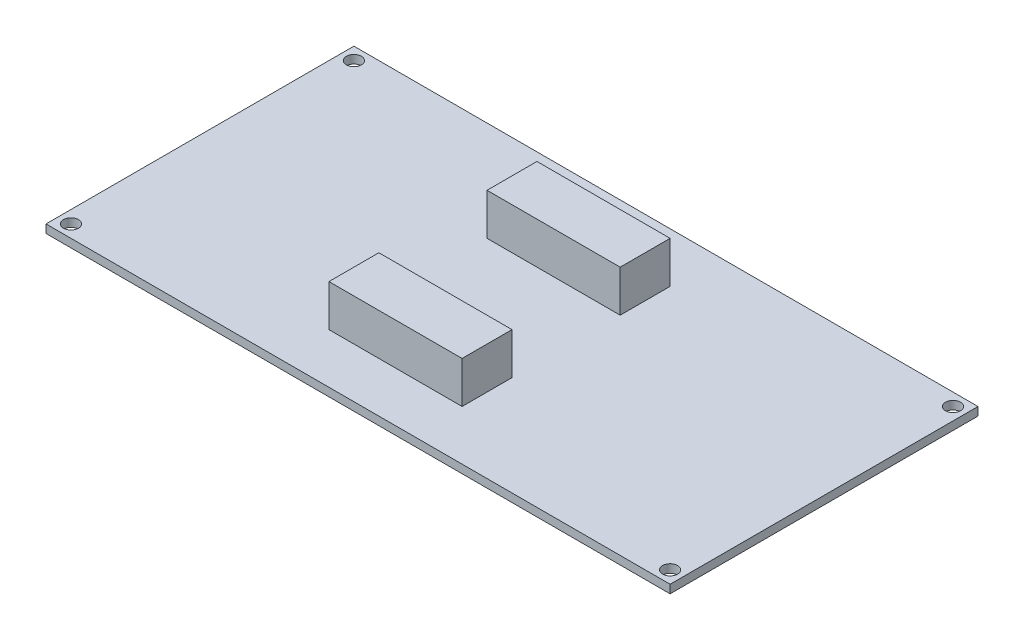
ISO-10303-21;
HEADER;
FILE_DESCRIPTION(('STEP AP214'),'2;1');
FILE_NAME('part.step','',(''),(''),'','','');
FILE_SCHEMA(('AUTOMOTIVE_DESIGN { 1 0 10303 214 1 1 1 1 }'));
ENDSEC;
DATA;
#1=APPLICATION_CONTEXT('core data for automotive mechanical design processes');
#2=APPLICATION_PROTOCOL_DEFINITION('international standard','automotive_design',2000,#1);
#3=PRODUCT_CONTEXT('',#1,'mechanical');
#4=PRODUCT('Part','Part','',(#3));
#5=PRODUCT_RELATED_PRODUCT_CATEGORY('part','',(#4));
#6=PRODUCT_DEFINITION_FORMATION('','',#4);
#7=PRODUCT_DEFINITION_CONTEXT('part definition',#1,'design');
#8=PRODUCT_DEFINITION('design','',#6,#7);
#9=PRODUCT_DEFINITION_SHAPE('','',#8);
#10=(LENGTH_UNIT() NAMED_UNIT(*) SI_UNIT(.MILLI.,.METRE.));
#11=(NAMED_UNIT(*) PLANE_ANGLE_UNIT() SI_UNIT($,.RADIAN.));
#12=(NAMED_UNIT(*) SI_UNIT($,.STERADIAN.) SOLID_ANGLE_UNIT());
#13=UNCERTAINTY_MEASURE_WITH_UNIT(LENGTH_MEASURE(1.E-05),#10,'distance_accuracy_value','');
#14=(GEOMETRIC_REPRESENTATION_CONTEXT(3) GLOBAL_UNCERTAINTY_ASSIGNED_CONTEXT((#13)) GLOBAL_UNIT_ASSIGNED_CONTEXT((#10,
#11,#12)) REPRESENTATION_CONTEXT('',''));
#15=CARTESIAN_POINT('',(0.,0.,0.));
#16=DIRECTION('',(0.,0.,1.));
#17=DIRECTION('',(1.,0.,0.));
#18=AXIS2_PLACEMENT_3D('',#15,#16,#17);
#19=CARTESIAN_POINT('',(0.,1.5875,0.));
#20=DIRECTION('',(0.,-1.,0.));
#21=DIRECTION('',(0.,0.,-1.));
#22=AXIS2_PLACEMENT_3D('',#19,#20,#21);
#23=PLANE('',#22);
#24=CARTESIAN_POINT('',(57.15,1.5875,-26.9875));
#25=DIRECTION('',(0.,1.,0.));
#26=DIRECTION('',(0.,0.,-1.));
#27=AXIS2_PLACEMENT_3D('',#24,#25,#26);
#28=CIRCLE('',#27,1.42875);
#29=CARTESIAN_POINT('',(57.15,1.5875,-28.41625));
#30=VERTEX_POINT('',#29);
#31=EDGE_CURVE('E468',#30,#30,#28,.T.);
#32=ORIENTED_EDGE('',*,*,#31,.F.);
#33=EDGE_LOOP('',(#32));
#34=FACE_BOUND('',#33,.T.);
#35=CARTESIAN_POINT('',(57.15,1.5875,26.9875));
#36=DIRECTION('',(0.,-1.,0.));
#37=DIRECTION('',(0.,0.,1.));
#38=AXIS2_PLACEMENT_3D('',#35,#36,#37);
#39=CIRCLE('',#38,1.42875);
#40=CARTESIAN_POINT('',(57.15,1.5875,28.41625));
#41=VERTEX_POINT('',#40);
#42=EDGE_CURVE('E472',#41,#41,#39,.T.);
#43=ORIENTED_EDGE('',*,*,#42,.T.);
#44=EDGE_LOOP('',(#43));
#45=FACE_BOUND('',#44,.T.);
#46=CARTESIAN_POINT('',(-57.15,1.5875,-26.9875));
#47=DIRECTION('',(0.,-1.,0.));
#48=DIRECTION('',(0.,0.,-1.));
#49=AXIS2_PLACEMENT_3D('',#46,#47,#48);
#50=CIRCLE('',#49,1.42875);
#51=CARTESIAN_POINT('',(-57.15,1.5875,-28.41625));
#52=VERTEX_POINT('',#51);
#53=EDGE_CURVE('E479',#52,#52,#50,.T.);
#54=ORIENTED_EDGE('',*,*,#53,.T.);
#55=EDGE_LOOP('',(#54));
#56=FACE_BOUND('',#55,.T.);
#57=CARTESIAN_POINT('',(-57.15,1.5875,26.9875));
#58=DIRECTION('',(0.,1.,0.));
#59=DIRECTION('',(0.,0.,1.));
#60=AXIS2_PLACEMENT_3D('',#57,#58,#59);
#61=CIRCLE('',#60,1.42875);
#62=CARTESIAN_POINT('',(-57.15,1.5875,28.41625));
#63=VERTEX_POINT('',#62);
#64=EDGE_CURVE('E487',#63,#63,#61,.T.);
#65=ORIENTED_EDGE('',*,*,#64,.F.);
#66=EDGE_LOOP('',(#65));
#67=FACE_BOUND('',#66,.T.);
#68=DIRECTION('',(1.,0.,0.));
#69=VECTOR('',#68,1.);
#70=CARTESIAN_POINT('',(-15.08125,1.5875,-19.84375));
#71=LINE('',#70,#69);
#72=CARTESIAN_POINT('',(-15.08125,1.5875,-19.84375));
#73=VERTEX_POINT('',#72);
#74=CARTESIAN_POINT('',(10.31875,1.5875,-19.84375));
#75=VERTEX_POINT('',#74);
#76=EDGE_CURVE('E168',#73,#75,#71,.T.);
#77=ORIENTED_EDGE('',*,*,#76,.T.);
#78=DIRECTION('',(0.,0.,1.));
#79=VECTOR('',#78,1.);
#80=CARTESIAN_POINT('',(10.31875,1.5875,-19.84375));
#81=LINE('',#80,#79);
#82=CARTESIAN_POINT('',(10.31875,1.5875,-10.31875));
#83=VERTEX_POINT('',#82);
#84=EDGE_CURVE('E135',#75,#83,#81,.T.);
#85=ORIENTED_EDGE('',*,*,#84,.T.);
#86=DIRECTION('',(-1.,0.,0.));
#87=VECTOR('',#86,1.);
#88=CARTESIAN_POINT('',(-15.08125,1.5875,-10.31875));
#89=LINE('',#88,#87);
#90=CARTESIAN_POINT('',(-15.08125,1.5875,-10.31875));
#91=VERTEX_POINT('',#90);
#92=EDGE_CURVE('E153',#83,#91,#89,.T.);
#93=ORIENTED_EDGE('',*,*,#92,.T.);
#94=DIRECTION('',(0.,0.,-1.));
#95=VECTOR('',#94,1.);
#96=CARTESIAN_POINT('',(-15.08125,1.5875,-19.84375));
#97=LINE('',#96,#95);
#98=EDGE_CURVE('E55',#91,#73,#97,.T.);
#99=ORIENTED_EDGE('',*,*,#98,.T.);
#100=EDGE_LOOP('',(#77,#85,#93,#99));
#101=FACE_BOUND('',#100,.T.);
#102=DIRECTION('',(0.,0.,1.));
#103=VECTOR('',#102,1.);
#104=CARTESIAN_POINT('',(-59.53125,1.5875,-29.36875));
#105=LINE('',#104,#103);
#106=CARTESIAN_POINT('',(-59.53125,1.5875,-29.36875));
#107=VERTEX_POINT('',#106);
#108=CARTESIAN_POINT('',(-59.53125,1.5875,29.36875));
#109=VERTEX_POINT('',#108);
#110=EDGE_CURVE('E226',#107,#109,#105,.T.);
#111=ORIENTED_EDGE('',*,*,#110,.T.);
#112=DIRECTION('',(1.,0.,0.));
#113=VECTOR('',#112,1.);
#114=CARTESIAN_POINT('',(59.53125,1.5875,29.36875));
#115=LINE('',#114,#113);
#116=CARTESIAN_POINT('',(59.53125,1.5875,29.36875));
#117=VERTEX_POINT('',#116);
#118=EDGE_CURVE('E230',#109,#117,#115,.T.);
#119=ORIENTED_EDGE('',*,*,#118,.T.);
#120=DIRECTION('',(0.,0.,-1.));
#121=VECTOR('',#120,1.);
#122=CARTESIAN_POINT('',(59.53125,1.5875,-29.36875));
#123=LINE('',#122,#121);
#124=CARTESIAN_POINT('',(59.53125,1.5875,-29.36875));
#125=VERTEX_POINT('',#124);
#126=EDGE_CURVE('E234',#117,#125,#123,.T.);
#127=ORIENTED_EDGE('',*,*,#126,.T.);
#128=DIRECTION('',(-1.,0.,0.));
#129=VECTOR('',#128,1.);
#130=CARTESIAN_POINT('',(59.53125,1.5875,-29.36875));
#131=LINE('',#130,#129);
#132=EDGE_CURVE('E237',#125,#107,#131,.T.);
#133=ORIENTED_EDGE('',*,*,#132,.T.);
#134=EDGE_LOOP('',(#111,#119,#127,#133));
#135=FACE_BOUND('',#134,.T.);
#136=DIRECTION('',(0.,0.,-1.));
#137=VECTOR('',#136,1.);
#138=CARTESIAN_POINT('',(10.31875,1.5875,19.84375));
#139=LINE('',#138,#137);
#140=CARTESIAN_POINT('',(10.31875,1.5875,19.84375));
#141=VERTEX_POINT('',#140);
#142=CARTESIAN_POINT('',(10.31875,1.5875,10.31875));
#143=VERTEX_POINT('',#142);
#144=EDGE_CURVE('E141',#141,#143,#139,.T.);
#145=ORIENTED_EDGE('',*,*,#144,.F.);
#146=DIRECTION('',(1.,0.,0.));
#147=VECTOR('',#146,1.);
#148=CARTESIAN_POINT('',(-15.08125,1.5875,19.84375));
#149=LINE('',#148,#147);
#150=CARTESIAN_POINT('',(-15.08125,1.5875,19.84375));
#151=VERTEX_POINT('',#150);
#152=EDGE_CURVE('E189',#151,#141,#149,.T.);
#153=ORIENTED_EDGE('',*,*,#152,.F.);
#154=DIRECTION('',(0.,0.,1.));
#155=VECTOR('',#154,1.);
#156=CARTESIAN_POINT('',(-15.08125,1.5875,19.84375));
#157=LINE('',#156,#155);
#158=CARTESIAN_POINT('',(-15.08125,1.5875,10.31875));
#159=VERTEX_POINT('',#158);
#160=EDGE_CURVE('E204',#159,#151,#157,.T.);
#161=ORIENTED_EDGE('',*,*,#160,.F.);
#162=DIRECTION('',(-1.,0.,0.));
#163=VECTOR('',#162,1.);
#164=CARTESIAN_POINT('',(-15.08125,1.5875,10.31875));
#165=LINE('',#164,#163);
#166=EDGE_CURVE('E63',#143,#159,#165,.T.);
#167=ORIENTED_EDGE('',*,*,#166,.F.);
#168=EDGE_LOOP('',(#145,#153,#161,#167));
#169=FACE_BOUND('',#168,.T.);
#170=ADVANCED_FACE('F39',(#34,#45,#56,#67,#101,#135,#169),#23,.F.);
#171=CARTESIAN_POINT('',(-59.53125,1.5875,-29.36875));
#172=DIRECTION('',(1.,0.,0.));
#173=DIRECTION('',(0.,0.,-1.));
#174=AXIS2_PLACEMENT_3D('',#171,#172,#173);
#175=PLANE('',#174);
#176=DIRECTION('',(0.,0.,1.));
#177=VECTOR('',#176,1.);
#178=CARTESIAN_POINT('',(-59.53125,0.,-29.36875));
#179=LINE('',#178,#177);
#180=CARTESIAN_POINT('',(-59.53125,0.,-29.36875));
#181=VERTEX_POINT('',#180);
#182=CARTESIAN_POINT('',(-59.53125,0.,29.36875));
#183=VERTEX_POINT('',#182);
#184=EDGE_CURVE('E225',#181,#183,#179,.T.);
#185=ORIENTED_EDGE('',*,*,#184,.T.);
#186=DIRECTION('',(0.,-1.,0.));
#187=VECTOR('',#186,1.);
#188=CARTESIAN_POINT('',(-59.53125,1.5875,29.36875));
#189=LINE('',#188,#187);
#190=EDGE_CURVE('E11',#109,#183,#189,.T.);
#191=ORIENTED_EDGE('',*,*,#190,.F.);
#192=ORIENTED_EDGE('',*,*,#110,.F.);
#193=DIRECTION('',(0.,-1.,0.));
#194=VECTOR('',#193,1.);
#195=CARTESIAN_POINT('',(-59.53125,1.5875,-29.36875));
#196=LINE('',#195,#194);
#197=EDGE_CURVE('E240',#107,#181,#196,.T.);
#198=ORIENTED_EDGE('',*,*,#197,.T.);
#199=EDGE_LOOP('',(#185,#191,#192,#198));
#200=FACE_BOUND('',#199,.T.);
#201=ADVANCED_FACE('F41',(#200),#175,.F.);
#202=CARTESIAN_POINT('',(59.53125,1.5875,29.36875));
#203=DIRECTION('',(0.,0.,-1.));
#204=DIRECTION('',(-1.,0.,0.));
#205=AXIS2_PLACEMENT_3D('',#202,#203,#204);
#206=PLANE('',#205);
#207=DIRECTION('',(1.,0.,0.));
#208=VECTOR('',#207,1.);
#209=CARTESIAN_POINT('',(59.53125,0.,29.36875));
#210=LINE('',#209,#208);
#211=CARTESIAN_POINT('',(59.53125,0.,29.36875));
#212=VERTEX_POINT('',#211);
#213=EDGE_CURVE('E244',#183,#212,#210,.T.);
#214=ORIENTED_EDGE('',*,*,#213,.T.);
#215=DIRECTION('',(0.,-1.,0.));
#216=VECTOR('',#215,1.);
#217=CARTESIAN_POINT('',(59.53125,1.5875,29.36875));
#218=LINE('',#217,#216);
#219=EDGE_CURVE('E48',#117,#212,#218,.T.);
#220=ORIENTED_EDGE('',*,*,#219,.F.);
#221=ORIENTED_EDGE('',*,*,#118,.F.);
#222=ORIENTED_EDGE('',*,*,#190,.T.);
#223=EDGE_LOOP('',(#214,#220,#221,#222));
#224=FACE_BOUND('',#223,.T.);
#225=ADVANCED_FACE('F279',(#224),#206,.F.);
#226=CARTESIAN_POINT('',(59.53125,1.5875,-29.36875));
#227=DIRECTION('',(-1.,0.,0.));
#228=DIRECTION('',(0.,0.,1.));
#229=AXIS2_PLACEMENT_3D('',#226,#227,#228);
#230=PLANE('',#229);
#231=DIRECTION('',(0.,0.,-1.));
#232=VECTOR('',#231,1.);
#233=CARTESIAN_POINT('',(59.53125,0.,-29.36875));
#234=LINE('',#233,#232);
#235=CARTESIAN_POINT('',(59.53125,0.,-29.36875));
#236=VERTEX_POINT('',#235);
#237=EDGE_CURVE('E247',#212,#236,#234,.T.);
#238=ORIENTED_EDGE('',*,*,#237,.T.);
#239=DIRECTION('',(0.,-1.,0.));
#240=VECTOR('',#239,1.);
#241=CARTESIAN_POINT('',(59.53125,1.5875,-29.36875));
#242=LINE('',#241,#240);
#243=EDGE_CURVE('E255',#125,#236,#242,.T.);
#244=ORIENTED_EDGE('',*,*,#243,.F.);
#245=ORIENTED_EDGE('',*,*,#126,.F.);
#246=ORIENTED_EDGE('',*,*,#219,.T.);
#247=EDGE_LOOP('',(#238,#244,#245,#246));
#248=FACE_BOUND('',#247,.T.);
#249=ADVANCED_FACE('F264',(#248),#230,.F.);
#250=CARTESIAN_POINT('',(59.53125,1.5875,-29.36875));
#251=DIRECTION('',(0.,0.,1.));
#252=DIRECTION('',(1.,0.,0.));
#253=AXIS2_PLACEMENT_3D('',#250,#251,#252);
#254=PLANE('',#253);
#255=DIRECTION('',(-1.,0.,0.));
#256=VECTOR('',#255,1.);
#257=CARTESIAN_POINT('',(59.53125,0.,-29.36875));
#258=LINE('',#257,#256);
#259=EDGE_CURVE('E231',#236,#181,#258,.T.);
#260=ORIENTED_EDGE('',*,*,#259,.T.);
#261=ORIENTED_EDGE('',*,*,#197,.F.);
#262=ORIENTED_EDGE('',*,*,#132,.F.);
#263=ORIENTED_EDGE('',*,*,#243,.T.);
#264=EDGE_LOOP('',(#260,#261,#262,#263));
#265=FACE_BOUND('',#264,.T.);
#266=ADVANCED_FACE('F273',(#265),#254,.F.);
#267=CARTESIAN_POINT('',(0.,0.,0.));
#268=DIRECTION('',(0.,-1.,0.));
#269=DIRECTION('',(0.,0.,-1.));
#270=AXIS2_PLACEMENT_3D('',#267,#268,#269);
#271=PLANE('',#270);
#272=CARTESIAN_POINT('',(57.15,0.,-26.9875));
#273=DIRECTION('',(0.,1.,0.));
#274=DIRECTION('',(0.,0.,-1.));
#275=AXIS2_PLACEMENT_3D('',#272,#273,#274);
#276=CIRCLE('',#275,1.42875);
#277=CARTESIAN_POINT('',(57.15,0.,-28.41625));
#278=VERTEX_POINT('',#277);
#279=EDGE_CURVE('E466',#278,#278,#276,.T.);
#280=ORIENTED_EDGE('',*,*,#279,.T.);
#281=EDGE_LOOP('',(#280));
#282=FACE_BOUND('',#281,.T.);
#283=CARTESIAN_POINT('',(57.15,0.,26.9875));
#284=DIRECTION('',(0.,-1.,0.));
#285=DIRECTION('',(0.,0.,1.));
#286=AXIS2_PLACEMENT_3D('',#283,#284,#285);
#287=CIRCLE('',#286,1.42875);
#288=CARTESIAN_POINT('',(57.15,0.,28.41625));
#289=VERTEX_POINT('',#288);
#290=EDGE_CURVE('E475',#289,#289,#287,.T.);
#291=ORIENTED_EDGE('',*,*,#290,.F.);
#292=EDGE_LOOP('',(#291));
#293=FACE_BOUND('',#292,.T.);
#294=CARTESIAN_POINT('',(-57.15,0.,-26.9875));
#295=DIRECTION('',(0.,-1.,0.));
#296=DIRECTION('',(0.,0.,-1.));
#297=AXIS2_PLACEMENT_3D('',#294,#295,#296);
#298=CIRCLE('',#297,1.42875);
#299=CARTESIAN_POINT('',(-57.15,0.,-28.41625));
#300=VERTEX_POINT('',#299);
#301=EDGE_CURVE('E483',#300,#300,#298,.T.);
#302=ORIENTED_EDGE('',*,*,#301,.F.);
#303=EDGE_LOOP('',(#302));
#304=FACE_BOUND('',#303,.T.);
#305=CARTESIAN_POINT('',(-57.15,0.,26.9875));
#306=DIRECTION('',(0.,1.,0.));
#307=DIRECTION('',(0.,0.,1.));
#308=AXIS2_PLACEMENT_3D('',#305,#306,#307);
#309=CIRCLE('',#308,1.42875);
#310=CARTESIAN_POINT('',(-57.15,0.,28.41625));
#311=VERTEX_POINT('',#310);
#312=EDGE_CURVE('E169',#311,#311,#309,.T.);
#313=ORIENTED_EDGE('',*,*,#312,.T.);
#314=EDGE_LOOP('',(#313));
#315=FACE_BOUND('',#314,.T.);
#316=ORIENTED_EDGE('',*,*,#184,.F.);
#317=ORIENTED_EDGE('',*,*,#259,.F.);
#318=ORIENTED_EDGE('',*,*,#237,.F.);
#319=ORIENTED_EDGE('',*,*,#213,.F.);
#320=EDGE_LOOP('',(#316,#317,#318,#319));
#321=FACE_BOUND('',#320,.T.);
#322=ADVANCED_FACE('F270',(#282,#293,#304,#315,#321),#271,.T.);
#323=CARTESIAN_POINT('',(10.31875,9.525,19.84375));
#324=DIRECTION('',(-1.,0.,0.));
#325=DIRECTION('',(0.,0.,1.));
#326=AXIS2_PLACEMENT_3D('',#323,#324,#325);
#327=PLANE('',#326);
#328=ORIENTED_EDGE('',*,*,#144,.T.);
#329=DIRECTION('',(0.,-1.,0.));
#330=VECTOR('',#329,1.);
#331=CARTESIAN_POINT('',(10.31875,9.525,10.31875));
#332=LINE('',#331,#330);
#333=CARTESIAN_POINT('',(10.31875,9.525,10.31875));
#334=VERTEX_POINT('',#333);
#335=EDGE_CURVE('E222',#334,#143,#332,.T.);
#336=ORIENTED_EDGE('',*,*,#335,.F.);
#337=DIRECTION('',(0.,0.,-1.));
#338=VECTOR('',#337,1.);
#339=CARTESIAN_POINT('',(10.31875,9.525,19.84375));
#340=LINE('',#339,#338);
#341=CARTESIAN_POINT('',(10.31875,9.525,19.84375));
#342=VERTEX_POINT('',#341);
#343=EDGE_CURVE('E184',#342,#334,#340,.T.);
#344=ORIENTED_EDGE('',*,*,#343,.F.);
#345=DIRECTION('',(0.,-1.,0.));
#346=VECTOR('',#345,1.);
#347=CARTESIAN_POINT('',(10.31875,9.525,19.84375));
#348=LINE('',#347,#346);
#349=EDGE_CURVE('E198',#342,#141,#348,.T.);
#350=ORIENTED_EDGE('',*,*,#349,.T.);
#351=EDGE_LOOP('',(#328,#336,#344,#350));
#352=FACE_BOUND('',#351,.T.);
#353=ADVANCED_FACE('F295',(#352),#327,.F.);
#354=CARTESIAN_POINT('',(-15.08125,9.525,10.31875));
#355=DIRECTION('',(0.,0.,1.));
#356=DIRECTION('',(1.,0.,0.));
#357=AXIS2_PLACEMENT_3D('',#354,#355,#356);
#358=PLANE('',#357);
#359=ORIENTED_EDGE('',*,*,#166,.T.);
#360=DIRECTION('',(0.,-1.,0.));
#361=VECTOR('',#360,1.);
#362=CARTESIAN_POINT('',(-15.08125,9.525,10.31875));
#363=LINE('',#362,#361);
#364=CARTESIAN_POINT('',(-15.08125,9.525,10.31875));
#365=VERTEX_POINT('',#364);
#366=EDGE_CURVE('E218',#365,#159,#363,.T.);
#367=ORIENTED_EDGE('',*,*,#366,.F.);
#368=DIRECTION('',(-1.,0.,0.));
#369=VECTOR('',#368,1.);
#370=CARTESIAN_POINT('',(-15.08125,9.525,10.31875));
#371=LINE('',#370,#369);
#372=EDGE_CURVE('E188',#334,#365,#371,.T.);
#373=ORIENTED_EDGE('',*,*,#372,.F.);
#374=ORIENTED_EDGE('',*,*,#335,.T.);
#375=EDGE_LOOP('',(#359,#367,#373,#374));
#376=FACE_BOUND('',#375,.T.);
#377=ADVANCED_FACE('F316',(#376),#358,.F.);
#378=CARTESIAN_POINT('',(-15.08125,9.525,19.84375));
#379=DIRECTION('',(1.,0.,0.));
#380=DIRECTION('',(0.,0.,-1.));
#381=AXIS2_PLACEMENT_3D('',#378,#379,#380);
#382=PLANE('',#381);
#383=ORIENTED_EDGE('',*,*,#160,.T.);
#384=DIRECTION('',(0.,-1.,0.));
#385=VECTOR('',#384,1.);
#386=CARTESIAN_POINT('',(-15.08125,9.525,19.84375));
#387=LINE('',#386,#385);
#388=CARTESIAN_POINT('',(-15.08125,9.525,19.84375));
#389=VERTEX_POINT('',#388);
#390=EDGE_CURVE('E214',#389,#151,#387,.T.);
#391=ORIENTED_EDGE('',*,*,#390,.F.);
#392=DIRECTION('',(0.,0.,1.));
#393=VECTOR('',#392,1.);
#394=CARTESIAN_POINT('',(-15.08125,9.525,19.84375));
#395=LINE('',#394,#393);
#396=EDGE_CURVE('E192',#365,#389,#395,.T.);
#397=ORIENTED_EDGE('',*,*,#396,.F.);
#398=ORIENTED_EDGE('',*,*,#366,.T.);
#399=EDGE_LOOP('',(#383,#391,#397,#398));
#400=FACE_BOUND('',#399,.T.);
#401=ADVANCED_FACE('F323',(#400),#382,.F.);
#402=CARTESIAN_POINT('',(-15.08125,9.525,19.84375));
#403=DIRECTION('',(0.,0.,-1.));
#404=DIRECTION('',(-1.,0.,0.));
#405=AXIS2_PLACEMENT_3D('',#402,#403,#404);
#406=PLANE('',#405);
#407=ORIENTED_EDGE('',*,*,#152,.T.);
#408=ORIENTED_EDGE('',*,*,#349,.F.);
#409=DIRECTION('',(1.,0.,0.));
#410=VECTOR('',#409,1.);
#411=CARTESIAN_POINT('',(-15.08125,9.525,19.84375));
#412=LINE('',#411,#410);
#413=EDGE_CURVE('E195',#389,#342,#412,.T.);
#414=ORIENTED_EDGE('',*,*,#413,.F.);
#415=ORIENTED_EDGE('',*,*,#390,.T.);
#416=EDGE_LOOP('',(#407,#408,#414,#415));
#417=FACE_BOUND('',#416,.T.);
#418=ADVANCED_FACE('F330',(#417),#406,.F.);
#419=CARTESIAN_POINT('',(0.,9.525,0.));
#420=DIRECTION('',(0.,-1.,0.));
#421=DIRECTION('',(0.,0.,-1.));
#422=AXIS2_PLACEMENT_3D('',#419,#420,#421);
#423=PLANE('',#422);
#424=ORIENTED_EDGE('',*,*,#343,.T.);
#425=ORIENTED_EDGE('',*,*,#372,.T.);
#426=ORIENTED_EDGE('',*,*,#396,.T.);
#427=ORIENTED_EDGE('',*,*,#413,.T.);
#428=EDGE_LOOP('',(#424,#425,#426,#427));
#429=FACE_BOUND('',#428,.T.);
#430=ADVANCED_FACE('F338',(#429),#423,.F.);
#431=CARTESIAN_POINT('',(10.31875,9.525,-19.84375));
#432=DIRECTION('',(1.,0.,0.));
#433=DIRECTION('',(0.,0.,-1.));
#434=AXIS2_PLACEMENT_3D('',#431,#432,#433);
#435=PLANE('',#434);
#436=ORIENTED_EDGE('',*,*,#84,.F.);
#437=DIRECTION('',(0.,-1.,0.));
#438=VECTOR('',#437,1.);
#439=CARTESIAN_POINT('',(10.31875,9.525,-19.84375));
#440=LINE('',#439,#438);
#441=CARTESIAN_POINT('',(10.31875,9.525,-19.84375));
#442=VERTEX_POINT('',#441);
#443=EDGE_CURVE('E129',#442,#75,#440,.T.);
#444=ORIENTED_EDGE('',*,*,#443,.F.);
#445=DIRECTION('',(0.,0.,1.));
#446=VECTOR('',#445,1.);
#447=CARTESIAN_POINT('',(10.31875,9.525,-19.84375));
#448=LINE('',#447,#446);
#449=CARTESIAN_POINT('',(10.31875,9.525,-10.31875));
#450=VERTEX_POINT('',#449);
#451=EDGE_CURVE('E132',#442,#450,#448,.T.);
#452=ORIENTED_EDGE('',*,*,#451,.T.);
#453=DIRECTION('',(0.,-1.,0.));
#454=VECTOR('',#453,1.);
#455=CARTESIAN_POINT('',(10.31875,9.525,-10.31875));
#456=LINE('',#455,#454);
#457=EDGE_CURVE('E165',#450,#83,#456,.T.);
#458=ORIENTED_EDGE('',*,*,#457,.T.);
#459=EDGE_LOOP('',(#436,#444,#452,#458));
#460=FACE_BOUND('',#459,.T.);
#461=ADVANCED_FACE('F131',(#460),#435,.T.);
#462=CARTESIAN_POINT('',(-15.08125,9.525,-19.84375));
#463=DIRECTION('',(0.,0.,-1.));
#464=DIRECTION('',(-1.,0.,0.));
#465=AXIS2_PLACEMENT_3D('',#462,#463,#464);
#466=PLANE('',#465);
#467=ORIENTED_EDGE('',*,*,#76,.F.);
#468=DIRECTION('',(0.,-1.,0.));
#469=VECTOR('',#468,1.);
#470=CARTESIAN_POINT('',(-15.08125,9.525,-19.84375));
#471=LINE('',#470,#469);
#472=CARTESIAN_POINT('',(-15.08125,9.525,-19.84375));
#473=VERTEX_POINT('',#472);
#474=EDGE_CURVE('E142',#473,#73,#471,.T.);
#475=ORIENTED_EDGE('',*,*,#474,.F.);
#476=DIRECTION('',(1.,0.,0.));
#477=VECTOR('',#476,1.);
#478=CARTESIAN_POINT('',(-15.08125,9.525,-19.84375));
#479=LINE('',#478,#477);
#480=EDGE_CURVE('E148',#473,#442,#479,.T.);
#481=ORIENTED_EDGE('',*,*,#480,.T.);
#482=ORIENTED_EDGE('',*,*,#443,.T.);
#483=EDGE_LOOP('',(#467,#475,#481,#482));
#484=FACE_BOUND('',#483,.T.);
#485=ADVANCED_FACE('F155',(#484),#466,.T.);
#486=CARTESIAN_POINT('',(-15.08125,9.525,-19.84375));
#487=DIRECTION('',(-1.,0.,0.));
#488=DIRECTION('',(0.,0.,1.));
#489=AXIS2_PLACEMENT_3D('',#486,#487,#488);
#490=PLANE('',#489);
#491=ORIENTED_EDGE('',*,*,#98,.F.);
#492=DIRECTION('',(0.,-1.,0.));
#493=VECTOR('',#492,1.);
#494=CARTESIAN_POINT('',(-15.08125,9.525,-10.31875));
#495=LINE('',#494,#493);
#496=CARTESIAN_POINT('',(-15.08125,9.525,-10.31875));
#497=VERTEX_POINT('',#496);
#498=EDGE_CURVE('E179',#497,#91,#495,.T.);
#499=ORIENTED_EDGE('',*,*,#498,.F.);
#500=DIRECTION('',(0.,0.,-1.));
#501=VECTOR('',#500,1.);
#502=CARTESIAN_POINT('',(-15.08125,9.525,-19.84375));
#503=LINE('',#502,#501);
#504=EDGE_CURVE('E157',#497,#473,#503,.T.);
#505=ORIENTED_EDGE('',*,*,#504,.T.);
#506=ORIENTED_EDGE('',*,*,#474,.T.);
#507=EDGE_LOOP('',(#491,#499,#505,#506));
#508=FACE_BOUND('',#507,.T.);
#509=ADVANCED_FACE('F359',(#508),#490,.T.);
#510=CARTESIAN_POINT('',(-15.08125,9.525,-10.31875));
#511=DIRECTION('',(0.,0.,1.));
#512=DIRECTION('',(1.,0.,0.));
#513=AXIS2_PLACEMENT_3D('',#510,#511,#512);
#514=PLANE('',#513);
#515=ORIENTED_EDGE('',*,*,#92,.F.);
#516=ORIENTED_EDGE('',*,*,#457,.F.);
#517=DIRECTION('',(-1.,0.,0.));
#518=VECTOR('',#517,1.);
#519=CARTESIAN_POINT('',(-15.08125,9.525,-10.31875));
#520=LINE('',#519,#518);
#521=EDGE_CURVE('E151',#450,#497,#520,.T.);
#522=ORIENTED_EDGE('',*,*,#521,.T.);
#523=ORIENTED_EDGE('',*,*,#498,.T.);
#524=EDGE_LOOP('',(#515,#516,#522,#523));
#525=FACE_BOUND('',#524,.T.);
#526=ADVANCED_FACE('F366',(#525),#514,.T.);
#527=CARTESIAN_POINT('',(0.,9.525,0.));
#528=DIRECTION('',(0.,-1.,0.));
#529=DIRECTION('',(0.,0.,1.));
#530=AXIS2_PLACEMENT_3D('',#527,#528,#529);
#531=PLANE('',#530);
#532=ORIENTED_EDGE('',*,*,#451,.F.);
#533=ORIENTED_EDGE('',*,*,#480,.F.);
#534=ORIENTED_EDGE('',*,*,#504,.F.);
#535=ORIENTED_EDGE('',*,*,#521,.F.);
#536=EDGE_LOOP('',(#532,#533,#534,#535));
#537=FACE_BOUND('',#536,.T.);
#538=ADVANCED_FACE('F146',(#537),#531,.F.);
#539=CARTESIAN_POINT('',(-57.15,0.,26.9875));
#540=DIRECTION('',(0.,1.,0.));
#541=DIRECTION('',(0.,0.,1.));
#542=AXIS2_PLACEMENT_3D('',#539,#540,#541);
#543=CYLINDRICAL_SURFACE('',#542,1.42875);
#544=ORIENTED_EDGE('',*,*,#312,.F.);
#545=EDGE_LOOP('',(#544));
#546=FACE_BOUND('',#545,.T.);
#547=ORIENTED_EDGE('',*,*,#64,.T.);
#548=EDGE_LOOP('',(#547));
#549=FACE_BOUND('',#548,.T.);
#550=ADVANCED_FACE('F380',(#546,#549),#543,.F.);
#551=CARTESIAN_POINT('',(-57.15,0.,-26.9875));
#552=DIRECTION('',(0.,1.,0.));
#553=DIRECTION('',(0.,0.,1.));
#554=AXIS2_PLACEMENT_3D('',#551,#552,#553);
#555=CYLINDRICAL_SURFACE('',#554,1.42875);
#556=ORIENTED_EDGE('',*,*,#301,.T.);
#557=EDGE_LOOP('',(#556));
#558=FACE_BOUND('',#557,.T.);
#559=ORIENTED_EDGE('',*,*,#53,.F.);
#560=EDGE_LOOP('',(#559));
#561=FACE_BOUND('',#560,.T.);
#562=ADVANCED_FACE('F387',(#558,#561),#555,.F.);
#563=CARTESIAN_POINT('',(57.15,0.,26.9875));
#564=DIRECTION('',(0.,1.,0.));
#565=DIRECTION('',(0.,0.,1.));
#566=AXIS2_PLACEMENT_3D('',#563,#564,#565);
#567=CYLINDRICAL_SURFACE('',#566,1.42875);
#568=ORIENTED_EDGE('',*,*,#290,.T.);
#569=EDGE_LOOP('',(#568));
#570=FACE_BOUND('',#569,.T.);
#571=ORIENTED_EDGE('',*,*,#42,.F.);
#572=EDGE_LOOP('',(#571));
#573=FACE_BOUND('',#572,.T.);
#574=ADVANCED_FACE('F394',(#570,#573),#567,.F.);
#575=CARTESIAN_POINT('',(57.15,0.,-26.9875));
#576=DIRECTION('',(0.,1.,0.));
#577=DIRECTION('',(0.,0.,1.));
#578=AXIS2_PLACEMENT_3D('',#575,#576,#577);
#579=CYLINDRICAL_SURFACE('',#578,1.42875);
#580=ORIENTED_EDGE('',*,*,#279,.F.);
#581=EDGE_LOOP('',(#580));
#582=FACE_BOUND('',#581,.T.);
#583=ORIENTED_EDGE('',*,*,#31,.T.);
#584=EDGE_LOOP('',(#583));
#585=FACE_BOUND('',#584,.T.);
#586=ADVANCED_FACE('F402',(#582,#585),#579,.F.);
#587=CLOSED_SHELL('',(#170,#201,#225,#249,#266,#322,#353,#377,#401,#418,#430,#461,#485,#509,
#526,#538,#550,#562,#574,#586));
#588=MANIFOLD_SOLID_BREP('B2',#587);
#589=ADVANCED_BREP_SHAPE_REPRESENTATION('',(#18,#588),#14);
#590=SHAPE_DEFINITION_REPRESENTATION(#9,#589);
ENDSEC;
END-ISO-10303-21;
